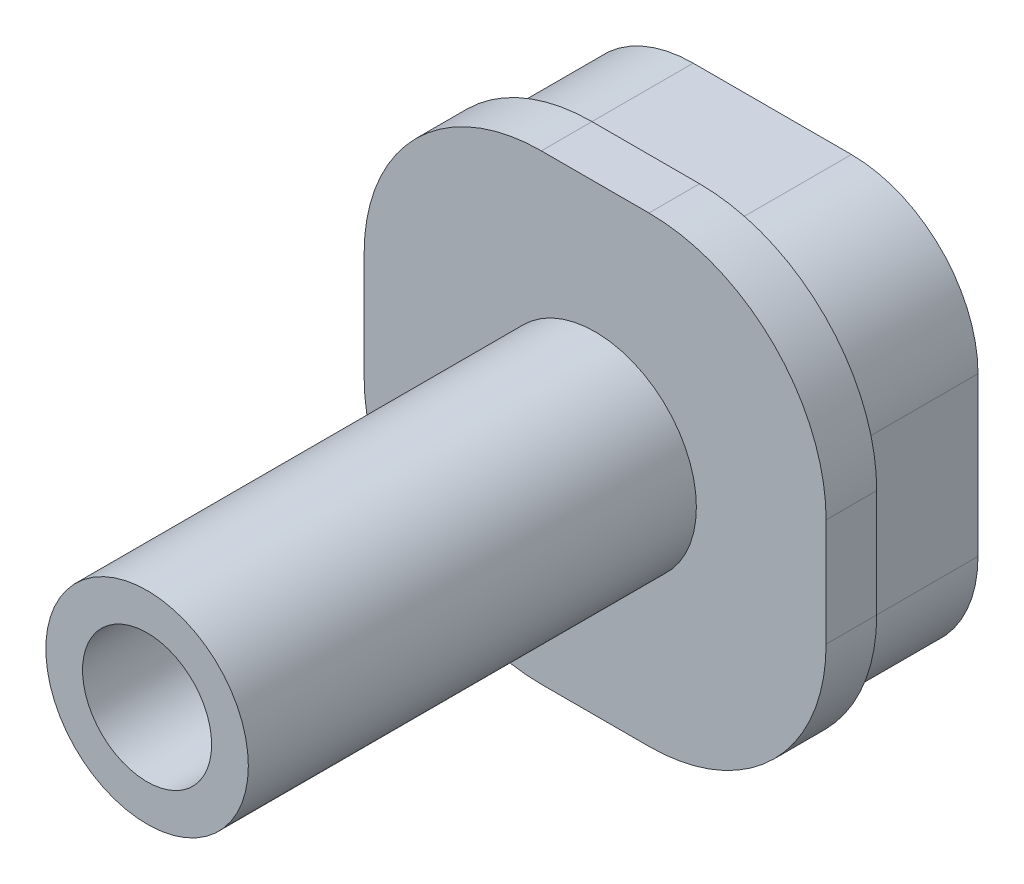
ISO-10303-21;
HEADER;
FILE_DESCRIPTION(('STEP AP214'),'2;1');
FILE_NAME('part.step','',(''),(''),'','','');
FILE_SCHEMA(('AUTOMOTIVE_DESIGN { 1 0 10303 214 1 1 1 1 }'));
ENDSEC;
DATA;
#1=APPLICATION_CONTEXT('core data for automotive mechanical design processes');
#2=APPLICATION_PROTOCOL_DEFINITION('international standard','automotive_design',2000,#1);
#3=PRODUCT_CONTEXT('',#1,'mechanical');
#4=PRODUCT('Part','Part','',(#3));
#5=PRODUCT_RELATED_PRODUCT_CATEGORY('part','',(#4));
#6=PRODUCT_DEFINITION_FORMATION('','',#4);
#7=PRODUCT_DEFINITION_CONTEXT('part definition',#1,'design');
#8=PRODUCT_DEFINITION('design','',#6,#7);
#9=PRODUCT_DEFINITION_SHAPE('','',#8);
#10=(LENGTH_UNIT() NAMED_UNIT(*) SI_UNIT(.MILLI.,.METRE.));
#11=(NAMED_UNIT(*) PLANE_ANGLE_UNIT() SI_UNIT($,.RADIAN.));
#12=(NAMED_UNIT(*) SI_UNIT($,.STERADIAN.) SOLID_ANGLE_UNIT());
#13=UNCERTAINTY_MEASURE_WITH_UNIT(LENGTH_MEASURE(1.E-05),#10,'distance_accuracy_value','');
#14=(GEOMETRIC_REPRESENTATION_CONTEXT(3) GLOBAL_UNCERTAINTY_ASSIGNED_CONTEXT((#13)) GLOBAL_UNIT_ASSIGNED_CONTEXT((#10,
#11,#12)) REPRESENTATION_CONTEXT('',''));
#15=CARTESIAN_POINT('',(0.,0.,0.));
#16=DIRECTION('',(0.,0.,1.));
#17=DIRECTION('',(1.,0.,0.));
#18=AXIS2_PLACEMENT_3D('',#15,#16,#17);
#19=CARTESIAN_POINT('',(0.,0.,0.));
#20=DIRECTION('',(0.,0.,1.));
#21=DIRECTION('',(1.,0.,0.));
#22=AXIS2_PLACEMENT_3D('',#19,#20,#21);
#23=PLANE('',#22);
#24=DIRECTION('',(1.,0.,0.));
#25=VECTOR('',#24,1.);
#26=CARTESIAN_POINT('',(8.125,-8.125,0.));
#27=LINE('',#26,#25);
#28=CARTESIAN_POINT('',(-3.125,-8.125,0.));
#29=VERTEX_POINT('',#28);
#30=CARTESIAN_POINT('',(3.125,-8.125,0.));
#31=VERTEX_POINT('',#30);
#32=EDGE_CURVE('E315',#29,#31,#27,.T.);
#33=ORIENTED_EDGE('',*,*,#32,.F.);
#34=CARTESIAN_POINT('',(-3.125,-3.125,0.));
#35=DIRECTION('',(0.,0.,1.));
#36=DIRECTION('',(1.,0.,0.));
#37=AXIS2_PLACEMENT_3D('',#34,#35,#36);
#38=CIRCLE('',#37,5.);
#39=CARTESIAN_POINT('',(-8.125,-3.125,0.));
#40=VERTEX_POINT('',#39);
#41=EDGE_CURVE('E348',#29,#40,#38,.F.);
#42=ORIENTED_EDGE('',*,*,#41,.T.);
#43=DIRECTION('',(0.,-1.,0.));
#44=VECTOR('',#43,1.);
#45=CARTESIAN_POINT('',(-8.125,-8.125,0.));
#46=LINE('',#45,#44);
#47=CARTESIAN_POINT('',(-8.125,3.125,0.));
#48=VERTEX_POINT('',#47);
#49=EDGE_CURVE('E288',#48,#40,#46,.T.);
#50=ORIENTED_EDGE('',*,*,#49,.F.);
#51=CARTESIAN_POINT('',(-3.125,3.125,0.));
#52=DIRECTION('',(0.,0.,1.));
#53=DIRECTION('',(1.,0.,0.));
#54=AXIS2_PLACEMENT_3D('',#51,#52,#53);
#55=CIRCLE('',#54,5.);
#56=CARTESIAN_POINT('',(-3.125,8.125,0.));
#57=VERTEX_POINT('',#56);
#58=EDGE_CURVE('E344',#48,#57,#55,.F.);
#59=ORIENTED_EDGE('',*,*,#58,.T.);
#60=DIRECTION('',(-1.,0.,0.));
#61=VECTOR('',#60,1.);
#62=CARTESIAN_POINT('',(8.125,8.125,0.));
#63=LINE('',#62,#61);
#64=CARTESIAN_POINT('',(3.125,8.125,0.));
#65=VERTEX_POINT('',#64);
#66=EDGE_CURVE('E303',#65,#57,#63,.T.);
#67=ORIENTED_EDGE('',*,*,#66,.F.);
#68=CARTESIAN_POINT('',(3.125,3.125,0.));
#69=DIRECTION('',(0.,0.,1.));
#70=DIRECTION('',(1.,0.,0.));
#71=AXIS2_PLACEMENT_3D('',#68,#69,#70);
#72=CIRCLE('',#71,5.);
#73=CARTESIAN_POINT('',(8.125,3.125,0.));
#74=VERTEX_POINT('',#73);
#75=EDGE_CURVE('E342',#65,#74,#72,.F.);
#76=ORIENTED_EDGE('',*,*,#75,.T.);
#77=DIRECTION('',(0.,1.,0.));
#78=VECTOR('',#77,1.);
#79=CARTESIAN_POINT('',(8.125,-8.125,0.));
#80=LINE('',#79,#78);
#81=CARTESIAN_POINT('',(8.125,-3.125,0.));
#82=VERTEX_POINT('',#81);
#83=EDGE_CURVE('E318',#82,#74,#80,.T.);
#84=ORIENTED_EDGE('',*,*,#83,.F.);
#85=CARTESIAN_POINT('',(3.125,-3.125,0.));
#86=DIRECTION('',(0.,0.,1.));
#87=DIRECTION('',(1.,0.,0.));
#88=AXIS2_PLACEMENT_3D('',#85,#86,#87);
#89=CIRCLE('',#88,5.);
#90=EDGE_CURVE('E346',#82,#31,#89,.F.);
#91=ORIENTED_EDGE('',*,*,#90,.T.);
#92=EDGE_LOOP('',(#33,#42,#50,#59,#67,#76,#84,#91));
#93=FACE_BOUND('',#92,.T.);
#94=DIRECTION('',(1.,0.,0.));
#95=VECTOR('',#94,1.);
#96=CARTESIAN_POINT('',(6.125,-6.125,0.));
#97=LINE('',#96,#95);
#98=CARTESIAN_POINT('',(-1.125,-6.125,0.));
#99=VERTEX_POINT('',#98);
#100=CARTESIAN_POINT('',(1.125,-6.125,0.));
#101=VERTEX_POINT('',#100);
#102=EDGE_CURVE('E283',#99,#101,#97,.T.);
#103=ORIENTED_EDGE('',*,*,#102,.T.);
#104=CARTESIAN_POINT('',(1.125,-1.125,0.));
#105=DIRECTION('',(0.,0.,1.));
#106=DIRECTION('',(1.,0.,0.));
#107=AXIS2_PLACEMENT_3D('',#104,#105,#106);
#108=CIRCLE('',#107,5.);
#109=CARTESIAN_POINT('',(6.125,-1.125,0.));
#110=VERTEX_POINT('',#109);
#111=EDGE_CURVE('E377',#101,#110,#108,.T.);
#112=ORIENTED_EDGE('',*,*,#111,.T.);
#113=DIRECTION('',(0.,1.,0.));
#114=VECTOR('',#113,1.);
#115=CARTESIAN_POINT('',(6.125,-6.125,0.));
#116=LINE('',#115,#114);
#117=CARTESIAN_POINT('',(6.125,1.125,0.));
#118=VERTEX_POINT('',#117);
#119=EDGE_CURVE('E289',#110,#118,#116,.T.);
#120=ORIENTED_EDGE('',*,*,#119,.T.);
#121=CARTESIAN_POINT('',(1.125,1.125,0.));
#122=DIRECTION('',(0.,0.,1.));
#123=DIRECTION('',(1.,0.,0.));
#124=AXIS2_PLACEMENT_3D('',#121,#122,#123);
#125=CIRCLE('',#124,5.);
#126=CARTESIAN_POINT('',(1.125,6.125,0.));
#127=VERTEX_POINT('',#126);
#128=EDGE_CURVE('E386',#118,#127,#125,.T.);
#129=ORIENTED_EDGE('',*,*,#128,.T.);
#130=DIRECTION('',(-1.,0.,0.));
#131=VECTOR('',#130,1.);
#132=CARTESIAN_POINT('',(6.125,6.125,0.));
#133=LINE('',#132,#131);
#134=CARTESIAN_POINT('',(-1.125,6.125,0.));
#135=VERTEX_POINT('',#134);
#136=EDGE_CURVE('E292',#127,#135,#133,.T.);
#137=ORIENTED_EDGE('',*,*,#136,.T.);
#138=CARTESIAN_POINT('',(-1.125,1.125,0.));
#139=DIRECTION('',(0.,0.,1.));
#140=DIRECTION('',(1.,0.,0.));
#141=AXIS2_PLACEMENT_3D('',#138,#139,#140);
#142=CIRCLE('',#141,5.);
#143=CARTESIAN_POINT('',(-6.125,1.125,0.));
#144=VERTEX_POINT('',#143);
#145=EDGE_CURVE('E206',#135,#144,#142,.T.);
#146=ORIENTED_EDGE('',*,*,#145,.T.);
#147=DIRECTION('',(0.,-1.,0.));
#148=VECTOR('',#147,1.);
#149=CARTESIAN_POINT('',(-6.125,-6.125,0.));
#150=LINE('',#149,#148);
#151=CARTESIAN_POINT('',(-6.125,-1.125,0.));
#152=VERTEX_POINT('',#151);
#153=EDGE_CURVE('E294',#144,#152,#150,.T.);
#154=ORIENTED_EDGE('',*,*,#153,.T.);
#155=CARTESIAN_POINT('',(-1.125,-1.125,0.));
#156=DIRECTION('',(0.,0.,1.));
#157=DIRECTION('',(1.,0.,0.));
#158=AXIS2_PLACEMENT_3D('',#155,#156,#157);
#159=CIRCLE('',#158,5.);
#160=EDGE_CURVE('E382',#152,#99,#159,.T.);
#161=ORIENTED_EDGE('',*,*,#160,.T.);
#162=EDGE_LOOP('',(#103,#112,#120,#129,#137,#146,#154,#161));
#163=FACE_BOUND('',#162,.T.);
#164=ADVANCED_FACE('F36',(#93,#163),#23,.F.);
#165=CARTESIAN_POINT('',(-8.125,-8.125,5.));
#166=DIRECTION('',(1.,0.,0.));
#167=DIRECTION('',(0.,0.,-1.));
#168=AXIS2_PLACEMENT_3D('',#165,#166,#167);
#169=PLANE('',#168);
#170=ORIENTED_EDGE('',*,*,#49,.T.);
#171=DIRECTION('',(0.,0.,-1.));
#172=VECTOR('',#171,1.);
#173=CARTESIAN_POINT('',(-8.125,-3.125,5.));
#174=LINE('',#173,#172);
#175=CARTESIAN_POINT('',(-8.125,-3.125,5.));
#176=VERTEX_POINT('',#175);
#177=EDGE_CURVE('E353',#40,#176,#174,.F.);
#178=ORIENTED_EDGE('',*,*,#177,.T.);
#179=DIRECTION('',(0.,-1.,0.));
#180=VECTOR('',#179,1.);
#181=CARTESIAN_POINT('',(-8.125,-8.125,5.));
#182=LINE('',#181,#180);
#183=CARTESIAN_POINT('',(-8.125,3.125,5.));
#184=VERTEX_POINT('',#183);
#185=EDGE_CURVE('E299',#184,#176,#182,.T.);
#186=ORIENTED_EDGE('',*,*,#185,.F.);
#187=DIRECTION('',(0.,0.,-1.));
#188=VECTOR('',#187,1.);
#189=CARTESIAN_POINT('',(-8.125,3.125,5.));
#190=LINE('',#189,#188);
#191=EDGE_CURVE('E350',#184,#48,#190,.T.);
#192=ORIENTED_EDGE('',*,*,#191,.T.);
#193=EDGE_LOOP('',(#170,#178,#186,#192));
#194=FACE_BOUND('',#193,.T.);
#195=ADVANCED_FACE('F421',(#194),#169,.F.);
#196=CARTESIAN_POINT('',(8.125,-8.125,5.));
#197=DIRECTION('',(0.,1.,0.));
#198=DIRECTION('',(-1.,0.,0.));
#199=AXIS2_PLACEMENT_3D('',#196,#197,#198);
#200=PLANE('',#199);
#201=DIRECTION('',(1.,0.,0.));
#202=VECTOR('',#201,1.);
#203=CARTESIAN_POINT('',(8.125,-8.125,5.));
#204=LINE('',#203,#202);
#205=CARTESIAN_POINT('',(-3.125,-8.125,5.));
#206=VERTEX_POINT('',#205);
#207=CARTESIAN_POINT('',(3.125,-8.125,5.));
#208=VERTEX_POINT('',#207);
#209=EDGE_CURVE('E302',#206,#208,#204,.T.);
#210=ORIENTED_EDGE('',*,*,#209,.F.);
#211=DIRECTION('',(0.,0.,-1.));
#212=VECTOR('',#211,1.);
#213=CARTESIAN_POINT('',(-3.125,-8.125,5.));
#214=LINE('',#213,#212);
#215=EDGE_CURVE('E339',#206,#29,#214,.T.);
#216=ORIENTED_EDGE('',*,*,#215,.T.);
#217=ORIENTED_EDGE('',*,*,#32,.T.);
#218=DIRECTION('',(0.,0.,-1.));
#219=VECTOR('',#218,1.);
#220=CARTESIAN_POINT('',(3.125,-8.125,5.));
#221=LINE('',#220,#219);
#222=EDGE_CURVE('E337',#31,#208,#221,.F.);
#223=ORIENTED_EDGE('',*,*,#222,.T.);
#224=EDGE_LOOP('',(#210,#216,#217,#223));
#225=FACE_BOUND('',#224,.T.);
#226=ADVANCED_FACE('F427',(#225),#200,.F.);
#227=CARTESIAN_POINT('',(8.125,-8.125,5.));
#228=DIRECTION('',(-1.,0.,0.));
#229=DIRECTION('',(0.,0.,1.));
#230=AXIS2_PLACEMENT_3D('',#227,#228,#229);
#231=PLANE('',#230);
#232=DIRECTION('',(0.,1.,0.));
#233=VECTOR('',#232,1.);
#234=CARTESIAN_POINT('',(8.125,-8.125,5.));
#235=LINE('',#234,#233);
#236=CARTESIAN_POINT('',(8.125,-3.125,5.));
#237=VERTEX_POINT('',#236);
#238=CARTESIAN_POINT('',(8.125,3.125,5.));
#239=VERTEX_POINT('',#238);
#240=EDGE_CURVE('E306',#237,#239,#235,.T.);
#241=ORIENTED_EDGE('',*,*,#240,.F.);
#242=DIRECTION('',(0.,0.,-1.));
#243=VECTOR('',#242,1.);
#244=CARTESIAN_POINT('',(8.125,-3.125,5.));
#245=LINE('',#244,#243);
#246=EDGE_CURVE('E369',#237,#82,#245,.T.);
#247=ORIENTED_EDGE('',*,*,#246,.T.);
#248=ORIENTED_EDGE('',*,*,#83,.T.);
#249=DIRECTION('',(0.,0.,-1.));
#250=VECTOR('',#249,1.);
#251=CARTESIAN_POINT('',(8.125,3.125,5.));
#252=LINE('',#251,#250);
#253=EDGE_CURVE('E367',#74,#239,#252,.F.);
#254=ORIENTED_EDGE('',*,*,#253,.T.);
#255=EDGE_LOOP('',(#241,#247,#248,#254));
#256=FACE_BOUND('',#255,.T.);
#257=ADVANCED_FACE('F436',(#256),#231,.F.);
#258=CARTESIAN_POINT('',(8.125,8.125,5.));
#259=DIRECTION('',(0.,-1.,0.));
#260=DIRECTION('',(1.,0.,0.));
#261=AXIS2_PLACEMENT_3D('',#258,#259,#260);
#262=PLANE('',#261);
#263=ORIENTED_EDGE('',*,*,#66,.T.);
#264=DIRECTION('',(0.,0.,-1.));
#265=VECTOR('',#264,1.);
#266=CARTESIAN_POINT('',(-3.125,8.125,5.));
#267=LINE('',#266,#265);
#268=CARTESIAN_POINT('',(-3.125,8.125,5.));
#269=VERTEX_POINT('',#268);
#270=EDGE_CURVE('E375',#57,#269,#267,.F.);
#271=ORIENTED_EDGE('',*,*,#270,.T.);
#272=DIRECTION('',(-1.,0.,0.));
#273=VECTOR('',#272,1.);
#274=CARTESIAN_POINT('',(8.125,8.125,5.));
#275=LINE('',#274,#273);
#276=CARTESIAN_POINT('',(3.125,8.125,5.));
#277=VERTEX_POINT('',#276);
#278=EDGE_CURVE('E309',#277,#269,#275,.T.);
#279=ORIENTED_EDGE('',*,*,#278,.F.);
#280=DIRECTION('',(0.,0.,-1.));
#281=VECTOR('',#280,1.);
#282=CARTESIAN_POINT('',(3.125,8.125,5.));
#283=LINE('',#282,#281);
#284=EDGE_CURVE('E372',#277,#65,#283,.T.);
#285=ORIENTED_EDGE('',*,*,#284,.T.);
#286=EDGE_LOOP('',(#263,#271,#279,#285));
#287=FACE_BOUND('',#286,.T.);
#288=ADVANCED_FACE('F433',(#287),#262,.F.);
#289=CARTESIAN_POINT('',(6.125,-6.125,5.));
#290=DIRECTION('',(-1.,0.,0.));
#291=DIRECTION('',(0.,0.,1.));
#292=AXIS2_PLACEMENT_3D('',#289,#290,#291);
#293=PLANE('',#292);
#294=ORIENTED_EDGE('',*,*,#119,.F.);
#295=DIRECTION('',(0.,0.,-1.));
#296=VECTOR('',#295,1.);
#297=CARTESIAN_POINT('',(6.125,-1.125,5.));
#298=LINE('',#297,#296);
#299=CARTESIAN_POINT('',(6.125,-1.125,5.));
#300=VERTEX_POINT('',#299);
#301=EDGE_CURVE('E330',#110,#300,#298,.F.);
#302=ORIENTED_EDGE('',*,*,#301,.T.);
#303=DIRECTION('',(0.,1.,0.));
#304=VECTOR('',#303,1.);
#305=CARTESIAN_POINT('',(6.125,-6.125,5.));
#306=LINE('',#305,#304);
#307=CARTESIAN_POINT('',(6.125,1.125,5.));
#308=VERTEX_POINT('',#307);
#309=EDGE_CURVE('E221',#300,#308,#306,.T.);
#310=ORIENTED_EDGE('',*,*,#309,.T.);
#311=DIRECTION('',(0.,0.,-1.));
#312=VECTOR('',#311,1.);
#313=CARTESIAN_POINT('',(6.125,1.125,0.));
#314=LINE('',#313,#312);
#315=EDGE_CURVE('E327',#308,#118,#314,.T.);
#316=ORIENTED_EDGE('',*,*,#315,.T.);
#317=EDGE_LOOP('',(#294,#302,#310,#316));
#318=FACE_BOUND('',#317,.T.);
#319=ADVANCED_FACE('F393',(#318),#293,.T.);
#320=CARTESIAN_POINT('',(6.125,6.125,5.));
#321=DIRECTION('',(0.,-1.,0.));
#322=DIRECTION('',(1.,0.,0.));
#323=AXIS2_PLACEMENT_3D('',#320,#321,#322);
#324=PLANE('',#323);
#325=ORIENTED_EDGE('',*,*,#136,.F.);
#326=DIRECTION('',(0.,0.,-1.));
#327=VECTOR('',#326,1.);
#328=CARTESIAN_POINT('',(1.125,6.125,5.));
#329=LINE('',#328,#327);
#330=CARTESIAN_POINT('',(1.125,6.125,5.));
#331=VERTEX_POINT('',#330);
#332=EDGE_CURVE('E210',#127,#331,#329,.F.);
#333=ORIENTED_EDGE('',*,*,#332,.T.);
#334=DIRECTION('',(-1.,0.,0.));
#335=VECTOR('',#334,1.);
#336=CARTESIAN_POINT('',(6.125,6.125,5.));
#337=LINE('',#336,#335);
#338=CARTESIAN_POINT('',(-1.125,6.125,5.));
#339=VERTEX_POINT('',#338);
#340=EDGE_CURVE('E214',#331,#339,#337,.T.);
#341=ORIENTED_EDGE('',*,*,#340,.T.);
#342=DIRECTION('',(0.,0.,-1.));
#343=VECTOR('',#342,1.);
#344=CARTESIAN_POINT('',(-1.125,6.125,0.));
#345=LINE('',#344,#343);
#346=EDGE_CURVE('E199',#339,#135,#345,.T.);
#347=ORIENTED_EDGE('',*,*,#346,.T.);
#348=EDGE_LOOP('',(#325,#333,#341,#347));
#349=FACE_BOUND('',#348,.T.);
#350=ADVANCED_FACE('F215',(#349),#324,.T.);
#351=CARTESIAN_POINT('',(-6.125,-6.125,5.));
#352=DIRECTION('',(1.,0.,0.));
#353=DIRECTION('',(0.,0.,-1.));
#354=AXIS2_PLACEMENT_3D('',#351,#352,#353);
#355=PLANE('',#354);
#356=DIRECTION('',(0.,-1.,0.));
#357=VECTOR('',#356,1.);
#358=CARTESIAN_POINT('',(-6.125,-6.125,5.));
#359=LINE('',#358,#357);
#360=CARTESIAN_POINT('',(-6.125,1.125,5.));
#361=VERTEX_POINT('',#360);
#362=CARTESIAN_POINT('',(-6.125,-1.125,5.));
#363=VERTEX_POINT('',#362);
#364=EDGE_CURVE('E220',#361,#363,#359,.T.);
#365=ORIENTED_EDGE('',*,*,#364,.T.);
#366=DIRECTION('',(0.,0.,-1.));
#367=VECTOR('',#366,1.);
#368=CARTESIAN_POINT('',(-6.125,-1.125,0.));
#369=LINE('',#368,#367);
#370=EDGE_CURVE('E211',#363,#152,#369,.T.);
#371=ORIENTED_EDGE('',*,*,#370,.T.);
#372=ORIENTED_EDGE('',*,*,#153,.F.);
#373=DIRECTION('',(0.,0.,-1.));
#374=VECTOR('',#373,1.);
#375=CARTESIAN_POINT('',(-6.125,1.125,5.));
#376=LINE('',#375,#374);
#377=EDGE_CURVE('E332',#144,#361,#376,.F.);
#378=ORIENTED_EDGE('',*,*,#377,.T.);
#379=EDGE_LOOP('',(#365,#371,#372,#378));
#380=FACE_BOUND('',#379,.T.);
#381=ADVANCED_FACE('F411',(#380),#355,.T.);
#382=CARTESIAN_POINT('',(6.125,-6.125,5.));
#383=DIRECTION('',(0.,1.,0.));
#384=DIRECTION('',(-1.,0.,0.));
#385=AXIS2_PLACEMENT_3D('',#382,#383,#384);
#386=PLANE('',#385);
#387=DIRECTION('',(1.,0.,0.));
#388=VECTOR('',#387,1.);
#389=CARTESIAN_POINT('',(6.125,-6.125,5.));
#390=LINE('',#389,#388);
#391=CARTESIAN_POINT('',(-1.125,-6.125,5.));
#392=VERTEX_POINT('',#391);
#393=CARTESIAN_POINT('',(1.125,-6.125,5.));
#394=VERTEX_POINT('',#393);
#395=EDGE_CURVE('E286',#392,#394,#390,.T.);
#396=ORIENTED_EDGE('',*,*,#395,.T.);
#397=DIRECTION('',(0.,0.,-1.));
#398=VECTOR('',#397,1.);
#399=CARTESIAN_POINT('',(1.125,-6.125,0.));
#400=LINE('',#399,#398);
#401=EDGE_CURVE('E324',#394,#101,#400,.T.);
#402=ORIENTED_EDGE('',*,*,#401,.T.);
#403=ORIENTED_EDGE('',*,*,#102,.F.);
#404=DIRECTION('',(0.,0.,-1.));
#405=VECTOR('',#404,1.);
#406=CARTESIAN_POINT('',(-1.125,-6.125,5.));
#407=LINE('',#406,#405);
#408=EDGE_CURVE('E312',#99,#392,#407,.F.);
#409=ORIENTED_EDGE('',*,*,#408,.T.);
#410=EDGE_LOOP('',(#396,#402,#403,#409));
#411=FACE_BOUND('',#410,.T.);
#412=ADVANCED_FACE('F402',(#411),#386,.T.);
#413=CARTESIAN_POINT('',(1.125,-1.125,5.));
#414=DIRECTION('',(0.,0.,1.));
#415=DIRECTION('',(1.,0.,0.));
#416=AXIS2_PLACEMENT_3D('',#413,#414,#415);
#417=CYLINDRICAL_SURFACE('',#416,5.);
#418=CARTESIAN_POINT('',(1.125,-1.125,5.));
#419=DIRECTION('',(0.,0.,1.));
#420=DIRECTION('',(1.,0.,0.));
#421=AXIS2_PLACEMENT_3D('',#418,#419,#420);
#422=CIRCLE('',#421,5.);
#423=EDGE_CURVE('E379',#300,#394,#422,.F.);
#424=ORIENTED_EDGE('',*,*,#423,.F.);
#425=ORIENTED_EDGE('',*,*,#301,.F.);
#426=ORIENTED_EDGE('',*,*,#111,.F.);
#427=ORIENTED_EDGE('',*,*,#401,.F.);
#428=EDGE_LOOP('',(#424,#425,#426,#427));
#429=FACE_BOUND('',#428,.T.);
#430=ADVANCED_FACE('F400',(#429),#417,.F.);
#431=CARTESIAN_POINT('',(-1.125,-1.125,5.));
#432=DIRECTION('',(0.,0.,1.));
#433=DIRECTION('',(1.,0.,0.));
#434=AXIS2_PLACEMENT_3D('',#431,#432,#433);
#435=CYLINDRICAL_SURFACE('',#434,5.);
#436=CARTESIAN_POINT('',(-1.125,-1.125,5.));
#437=DIRECTION('',(0.,0.,1.));
#438=DIRECTION('',(1.,0.,0.));
#439=AXIS2_PLACEMENT_3D('',#436,#437,#438);
#440=CIRCLE('',#439,5.);
#441=EDGE_CURVE('E384',#392,#363,#440,.F.);
#442=ORIENTED_EDGE('',*,*,#441,.F.);
#443=ORIENTED_EDGE('',*,*,#408,.F.);
#444=ORIENTED_EDGE('',*,*,#160,.F.);
#445=ORIENTED_EDGE('',*,*,#370,.F.);
#446=EDGE_LOOP('',(#442,#443,#444,#445));
#447=FACE_BOUND('',#446,.T.);
#448=ADVANCED_FACE('F408',(#447),#435,.F.);
#449=CARTESIAN_POINT('',(1.125,1.125,5.));
#450=DIRECTION('',(0.,0.,1.));
#451=DIRECTION('',(1.,0.,0.));
#452=AXIS2_PLACEMENT_3D('',#449,#450,#451);
#453=CYLINDRICAL_SURFACE('',#452,5.);
#454=CARTESIAN_POINT('',(1.125,1.125,5.));
#455=DIRECTION('',(0.,0.,1.));
#456=DIRECTION('',(1.,0.,0.));
#457=AXIS2_PLACEMENT_3D('',#454,#455,#456);
#458=CIRCLE('',#457,5.);
#459=EDGE_CURVE('E229',#331,#308,#458,.F.);
#460=ORIENTED_EDGE('',*,*,#459,.F.);
#461=ORIENTED_EDGE('',*,*,#332,.F.);
#462=ORIENTED_EDGE('',*,*,#128,.F.);
#463=ORIENTED_EDGE('',*,*,#315,.F.);
#464=EDGE_LOOP('',(#460,#461,#462,#463));
#465=FACE_BOUND('',#464,.T.);
#466=ADVANCED_FACE('F390',(#465),#453,.F.);
#467=CARTESIAN_POINT('',(-1.125,1.125,5.));
#468=DIRECTION('',(0.,0.,1.));
#469=DIRECTION('',(1.,0.,0.));
#470=AXIS2_PLACEMENT_3D('',#467,#468,#469);
#471=CYLINDRICAL_SURFACE('',#470,5.);
#472=CARTESIAN_POINT('',(-1.125,1.125,5.));
#473=DIRECTION('',(0.,0.,1.));
#474=DIRECTION('',(1.,0.,0.));
#475=AXIS2_PLACEMENT_3D('',#472,#473,#474);
#476=CIRCLE('',#475,5.);
#477=EDGE_CURVE('E204',#361,#339,#476,.F.);
#478=ORIENTED_EDGE('',*,*,#477,.F.);
#479=ORIENTED_EDGE('',*,*,#377,.F.);
#480=ORIENTED_EDGE('',*,*,#145,.F.);
#481=ORIENTED_EDGE('',*,*,#346,.F.);
#482=EDGE_LOOP('',(#478,#479,#480,#481));
#483=FACE_BOUND('',#482,.T.);
#484=ADVANCED_FACE('F201',(#483),#471,.F.);
#485=CARTESIAN_POINT('',(-3.125,-3.125,5.));
#486=DIRECTION('',(0.,0.,-1.));
#487=DIRECTION('',(-1.,0.,0.));
#488=AXIS2_PLACEMENT_3D('',#485,#486,#487);
#489=CYLINDRICAL_SURFACE('',#488,5.);
#490=CARTESIAN_POINT('',(-3.125,-3.125,5.));
#491=DIRECTION('',(0.,0.,1.));
#492=DIRECTION('',(1.,0.,0.));
#493=AXIS2_PLACEMENT_3D('',#490,#491,#492);
#494=CIRCLE('',#493,5.);
#495=EDGE_CURVE('E364',#176,#206,#494,.T.);
#496=ORIENTED_EDGE('',*,*,#495,.F.);
#497=ORIENTED_EDGE('',*,*,#177,.F.);
#498=ORIENTED_EDGE('',*,*,#41,.F.);
#499=ORIENTED_EDGE('',*,*,#215,.F.);
#500=EDGE_LOOP('',(#496,#497,#498,#499));
#501=FACE_BOUND('',#500,.T.);
#502=ADVANCED_FACE('F452',(#501),#489,.T.);
#503=CARTESIAN_POINT('',(3.125,-3.125,5.));
#504=DIRECTION('',(0.,0.,-1.));
#505=DIRECTION('',(-1.,0.,0.));
#506=AXIS2_PLACEMENT_3D('',#503,#504,#505);
#507=CYLINDRICAL_SURFACE('',#506,5.);
#508=CARTESIAN_POINT('',(3.125,-3.125,5.));
#509=DIRECTION('',(0.,0.,1.));
#510=DIRECTION('',(1.,0.,0.));
#511=AXIS2_PLACEMENT_3D('',#508,#509,#510);
#512=CIRCLE('',#511,5.);
#513=EDGE_CURVE('E361',#208,#237,#512,.T.);
#514=ORIENTED_EDGE('',*,*,#513,.F.);
#515=ORIENTED_EDGE('',*,*,#222,.F.);
#516=ORIENTED_EDGE('',*,*,#90,.F.);
#517=ORIENTED_EDGE('',*,*,#246,.F.);
#518=EDGE_LOOP('',(#514,#515,#516,#517));
#519=FACE_BOUND('',#518,.T.);
#520=ADVANCED_FACE('F455',(#519),#507,.T.);
#521=CARTESIAN_POINT('',(-3.125,3.125,5.));
#522=DIRECTION('',(0.,0.,-1.));
#523=DIRECTION('',(-1.,0.,0.));
#524=AXIS2_PLACEMENT_3D('',#521,#522,#523);
#525=CYLINDRICAL_SURFACE('',#524,5.);
#526=CARTESIAN_POINT('',(-3.125,3.125,5.));
#527=DIRECTION('',(0.,0.,1.));
#528=DIRECTION('',(1.,0.,0.));
#529=AXIS2_PLACEMENT_3D('',#526,#527,#528);
#530=CIRCLE('',#529,5.);
#531=EDGE_CURVE('E358',#269,#184,#530,.T.);
#532=ORIENTED_EDGE('',*,*,#531,.F.);
#533=ORIENTED_EDGE('',*,*,#270,.F.);
#534=ORIENTED_EDGE('',*,*,#58,.F.);
#535=ORIENTED_EDGE('',*,*,#191,.F.);
#536=EDGE_LOOP('',(#532,#533,#534,#535));
#537=FACE_BOUND('',#536,.T.);
#538=ADVANCED_FACE('F459',(#537),#525,.T.);
#539=CARTESIAN_POINT('',(3.125,3.125,5.));
#540=DIRECTION('',(0.,0.,-1.));
#541=DIRECTION('',(-1.,0.,0.));
#542=AXIS2_PLACEMENT_3D('',#539,#540,#541);
#543=CYLINDRICAL_SURFACE('',#542,5.);
#544=CARTESIAN_POINT('',(3.125,3.125,5.));
#545=DIRECTION('',(0.,0.,1.));
#546=DIRECTION('',(1.,0.,0.));
#547=AXIS2_PLACEMENT_3D('',#544,#545,#546);
#548=CIRCLE('',#547,5.);
#549=EDGE_CURVE('E355',#239,#277,#548,.T.);
#550=ORIENTED_EDGE('',*,*,#549,.F.);
#551=ORIENTED_EDGE('',*,*,#253,.F.);
#552=ORIENTED_EDGE('',*,*,#75,.F.);
#553=ORIENTED_EDGE('',*,*,#284,.F.);
#554=EDGE_LOOP('',(#550,#551,#552,#553));
#555=FACE_BOUND('',#554,.T.);
#556=ADVANCED_FACE('F463',(#555),#543,.T.);
#557=CARTESIAN_POINT('',(0.,0.,5.));
#558=DIRECTION('',(0.,0.,-1.));
#559=DIRECTION('',(-1.,0.,0.));
#560=AXIS2_PLACEMENT_3D('',#557,#558,#559);
#561=PLANE('',#560);
#562=ORIENTED_EDGE('',*,*,#340,.F.);
#563=ORIENTED_EDGE('',*,*,#459,.T.);
#564=ORIENTED_EDGE('',*,*,#309,.F.);
#565=ORIENTED_EDGE('',*,*,#423,.T.);
#566=ORIENTED_EDGE('',*,*,#395,.F.);
#567=ORIENTED_EDGE('',*,*,#441,.T.);
#568=ORIENTED_EDGE('',*,*,#364,.F.);
#569=ORIENTED_EDGE('',*,*,#477,.T.);
#570=EDGE_LOOP('',(#562,#563,#564,#565,#566,#567,#568,#569));
#571=FACE_BOUND('',#570,.T.);
#572=ADVANCED_FACE('F223',(#571),#561,.T.);
#573=DIRECTION('',(0.,1.,0.));
#574=VECTOR('',#573,1.);
#575=CARTESIAN_POINT('',(9.125,9.125,5.));
#576=LINE('',#575,#574);
#577=CARTESIAN_POINT('',(9.125,-2.125,5.));
#578=VERTEX_POINT('',#577);
#579=CARTESIAN_POINT('',(9.125,2.125,5.));
#580=VERTEX_POINT('',#579);
#581=EDGE_CURVE('E274',#578,#580,#576,.T.);
#582=ORIENTED_EDGE('',*,*,#581,.F.);
#583=CARTESIAN_POINT('',(2.125,-2.125,5.));
#584=DIRECTION('',(0.,0.,-1.));
#585=DIRECTION('',(-1.,0.,0.));
#586=AXIS2_PLACEMENT_3D('',#583,#584,#585);
#587=CIRCLE('',#586,7.);
#588=CARTESIAN_POINT('',(2.125,-9.125,5.));
#589=VERTEX_POINT('',#588);
#590=EDGE_CURVE('E241',#578,#589,#587,.T.);
#591=ORIENTED_EDGE('',*,*,#590,.T.);
#592=DIRECTION('',(1.,0.,0.));
#593=VECTOR('',#592,1.);
#594=CARTESIAN_POINT('',(9.125,-9.125,5.));
#595=LINE('',#594,#593);
#596=CARTESIAN_POINT('',(-2.125,-9.125,5.));
#597=VERTEX_POINT('',#596);
#598=EDGE_CURVE('E279',#597,#589,#595,.T.);
#599=ORIENTED_EDGE('',*,*,#598,.F.);
#600=CARTESIAN_POINT('',(-2.125,-2.125,5.));
#601=DIRECTION('',(0.,0.,-1.));
#602=DIRECTION('',(-1.,0.,0.));
#603=AXIS2_PLACEMENT_3D('',#600,#601,#602);
#604=CIRCLE('',#603,7.);
#605=CARTESIAN_POINT('',(-9.125,-2.125,5.));
#606=VERTEX_POINT('',#605);
#607=EDGE_CURVE('E239',#597,#606,#604,.T.);
#608=ORIENTED_EDGE('',*,*,#607,.T.);
#609=DIRECTION('',(0.,-1.,0.));
#610=VECTOR('',#609,1.);
#611=CARTESIAN_POINT('',(-9.125,9.125,5.));
#612=LINE('',#611,#610);
#613=CARTESIAN_POINT('',(-9.125,2.125,5.));
#614=VERTEX_POINT('',#613);
#615=EDGE_CURVE('E492',#614,#606,#612,.T.);
#616=ORIENTED_EDGE('',*,*,#615,.F.);
#617=CARTESIAN_POINT('',(-2.125,2.125,5.));
#618=DIRECTION('',(0.,0.,-1.));
#619=DIRECTION('',(-1.,0.,0.));
#620=AXIS2_PLACEMENT_3D('',#617,#618,#619);
#621=CIRCLE('',#620,7.);
#622=CARTESIAN_POINT('',(-2.125,9.125,5.));
#623=VERTEX_POINT('',#622);
#624=EDGE_CURVE('E237',#614,#623,#621,.T.);
#625=ORIENTED_EDGE('',*,*,#624,.T.);
#626=DIRECTION('',(-1.,0.,0.));
#627=VECTOR('',#626,1.);
#628=CARTESIAN_POINT('',(9.125,9.125,5.));
#629=LINE('',#628,#627);
#630=CARTESIAN_POINT('',(2.125,9.125,5.));
#631=VERTEX_POINT('',#630);
#632=EDGE_CURVE('E264',#631,#623,#629,.T.);
#633=ORIENTED_EDGE('',*,*,#632,.F.);
#634=CARTESIAN_POINT('',(2.125,2.125,5.));
#635=DIRECTION('',(0.,0.,-1.));
#636=DIRECTION('',(-1.,0.,0.));
#637=AXIS2_PLACEMENT_3D('',#634,#635,#636);
#638=CIRCLE('',#637,7.);
#639=EDGE_CURVE('E235',#631,#580,#638,.T.);
#640=ORIENTED_EDGE('',*,*,#639,.T.);
#641=EDGE_LOOP('',(#582,#591,#599,#608,#616,#625,#633,#640));
#642=FACE_BOUND('',#641,.T.);
#643=ORIENTED_EDGE('',*,*,#531,.T.);
#644=ORIENTED_EDGE('',*,*,#185,.T.);
#645=ORIENTED_EDGE('',*,*,#495,.T.);
#646=ORIENTED_EDGE('',*,*,#209,.T.);
#647=ORIENTED_EDGE('',*,*,#513,.T.);
#648=ORIENTED_EDGE('',*,*,#240,.T.);
#649=ORIENTED_EDGE('',*,*,#549,.T.);
#650=ORIENTED_EDGE('',*,*,#278,.T.);
#651=EDGE_LOOP('',(#643,#644,#645,#646,#647,#648,#649,#650));
#652=FACE_BOUND('',#651,.T.);
#653=ADVANCED_FACE('F269',(#642,#652),#561,.T.);
#654=CARTESIAN_POINT('',(-9.125,9.125,7.));
#655=DIRECTION('',(1.,0.,0.));
#656=DIRECTION('',(0.,0.,-1.));
#657=AXIS2_PLACEMENT_3D('',#654,#655,#656);
#658=PLANE('',#657);
#659=ORIENTED_EDGE('',*,*,#615,.T.);
#660=DIRECTION('',(0.,0.,-1.));
#661=VECTOR('',#660,1.);
#662=CARTESIAN_POINT('',(-9.125,-2.125,7.));
#663=LINE('',#662,#661);
#664=CARTESIAN_POINT('',(-9.125,-2.125,7.));
#665=VERTEX_POINT('',#664);
#666=EDGE_CURVE('E258',#606,#665,#663,.F.);
#667=ORIENTED_EDGE('',*,*,#666,.T.);
#668=DIRECTION('',(0.,-1.,0.));
#669=VECTOR('',#668,1.);
#670=CARTESIAN_POINT('',(-9.125,9.125,7.));
#671=LINE('',#670,#669);
#672=CARTESIAN_POINT('',(-9.125,2.125,7.));
#673=VERTEX_POINT('',#672);
#674=EDGE_CURVE('E273',#673,#665,#671,.T.);
#675=ORIENTED_EDGE('',*,*,#674,.F.);
#676=DIRECTION('',(0.,0.,-1.));
#677=VECTOR('',#676,1.);
#678=CARTESIAN_POINT('',(-9.125,2.125,7.));
#679=LINE('',#678,#677);
#680=EDGE_CURVE('E255',#673,#614,#679,.T.);
#681=ORIENTED_EDGE('',*,*,#680,.T.);
#682=EDGE_LOOP('',(#659,#667,#675,#681));
#683=FACE_BOUND('',#682,.T.);
#684=ADVANCED_FACE('F490',(#683),#658,.F.);
#685=CARTESIAN_POINT('',(9.125,-9.125,7.));
#686=DIRECTION('',(0.,1.,0.));
#687=DIRECTION('',(0.,0.,1.));
#688=AXIS2_PLACEMENT_3D('',#685,#686,#687);
#689=PLANE('',#688);
#690=ORIENTED_EDGE('',*,*,#598,.T.);
#691=DIRECTION('',(0.,0.,-1.));
#692=VECTOR('',#691,1.);
#693=CARTESIAN_POINT('',(2.125,-9.125,7.));
#694=LINE('',#693,#692);
#695=CARTESIAN_POINT('',(2.125,-9.125,7.));
#696=VERTEX_POINT('',#695);
#697=EDGE_CURVE('E246',#589,#696,#694,.F.);
#698=ORIENTED_EDGE('',*,*,#697,.T.);
#699=DIRECTION('',(1.,0.,0.));
#700=VECTOR('',#699,1.);
#701=CARTESIAN_POINT('',(9.125,-9.125,7.));
#702=LINE('',#701,#700);
#703=CARTESIAN_POINT('',(-2.125,-9.125,7.));
#704=VERTEX_POINT('',#703);
#705=EDGE_CURVE('E277',#704,#696,#702,.T.);
#706=ORIENTED_EDGE('',*,*,#705,.F.);
#707=DIRECTION('',(0.,0.,-1.));
#708=VECTOR('',#707,1.);
#709=CARTESIAN_POINT('',(-2.125,-9.125,7.));
#710=LINE('',#709,#708);
#711=EDGE_CURVE('E243',#704,#597,#710,.T.);
#712=ORIENTED_EDGE('',*,*,#711,.T.);
#713=EDGE_LOOP('',(#690,#698,#706,#712));
#714=FACE_BOUND('',#713,.T.);
#715=ADVANCED_FACE('F498',(#714),#689,.F.);
#716=CARTESIAN_POINT('',(9.125,9.125,7.));
#717=DIRECTION('',(-1.,0.,0.));
#718=DIRECTION('',(0.,0.,1.));
#719=AXIS2_PLACEMENT_3D('',#716,#717,#718);
#720=PLANE('',#719);
#721=DIRECTION('',(0.,1.,0.));
#722=VECTOR('',#721,1.);
#723=CARTESIAN_POINT('',(9.125,9.125,7.));
#724=LINE('',#723,#722);
#725=CARTESIAN_POINT('',(9.125,-2.125,7.));
#726=VERTEX_POINT('',#725);
#727=CARTESIAN_POINT('',(9.125,2.125,7.));
#728=VERTEX_POINT('',#727);
#729=EDGE_CURVE('E501',#726,#728,#724,.T.);
#730=ORIENTED_EDGE('',*,*,#729,.F.);
#731=DIRECTION('',(0.,0.,-1.));
#732=VECTOR('',#731,1.);
#733=CARTESIAN_POINT('',(9.125,-2.125,7.));
#734=LINE('',#733,#732);
#735=EDGE_CURVE('E227',#726,#578,#734,.T.);
#736=ORIENTED_EDGE('',*,*,#735,.T.);
#737=ORIENTED_EDGE('',*,*,#581,.T.);
#738=DIRECTION('',(0.,0.,-1.));
#739=VECTOR('',#738,1.);
#740=CARTESIAN_POINT('',(9.125,2.125,7.));
#741=LINE('',#740,#739);
#742=EDGE_CURVE('E225',#580,#728,#741,.F.);
#743=ORIENTED_EDGE('',*,*,#742,.T.);
#744=EDGE_LOOP('',(#730,#736,#737,#743));
#745=FACE_BOUND('',#744,.T.);
#746=ADVANCED_FACE('F510',(#745),#720,.F.);
#747=CARTESIAN_POINT('',(9.125,9.125,7.));
#748=DIRECTION('',(0.,-1.,0.));
#749=DIRECTION('',(0.,0.,-1.));
#750=AXIS2_PLACEMENT_3D('',#747,#748,#749);
#751=PLANE('',#750);
#752=ORIENTED_EDGE('',*,*,#632,.T.);
#753=DIRECTION('',(0.,0.,-1.));
#754=VECTOR('',#753,1.);
#755=CARTESIAN_POINT('',(-2.125,9.125,7.));
#756=LINE('',#755,#754);
#757=CARTESIAN_POINT('',(-2.125,9.125,7.));
#758=VERTEX_POINT('',#757);
#759=EDGE_CURVE('E40',#623,#758,#756,.F.);
#760=ORIENTED_EDGE('',*,*,#759,.T.);
#761=DIRECTION('',(-1.,0.,0.));
#762=VECTOR('',#761,1.);
#763=CARTESIAN_POINT('',(9.125,9.125,7.));
#764=LINE('',#763,#762);
#765=CARTESIAN_POINT('',(2.125,9.125,7.));
#766=VERTEX_POINT('',#765);
#767=EDGE_CURVE('E265',#766,#758,#764,.T.);
#768=ORIENTED_EDGE('',*,*,#767,.F.);
#769=DIRECTION('',(0.,0.,-1.));
#770=VECTOR('',#769,1.);
#771=CARTESIAN_POINT('',(2.125,9.125,7.));
#772=LINE('',#771,#770);
#773=EDGE_CURVE('E259',#766,#631,#772,.T.);
#774=ORIENTED_EDGE('',*,*,#773,.T.);
#775=EDGE_LOOP('',(#752,#760,#768,#774));
#776=FACE_BOUND('',#775,.T.);
#777=ADVANCED_FACE('F263',(#776),#751,.F.);
#778=CARTESIAN_POINT('',(0.,0.,7.));
#779=DIRECTION('',(0.,0.,-1.));
#780=DIRECTION('',(-1.,0.,0.));
#781=AXIS2_PLACEMENT_3D('',#778,#779,#780);
#782=PLANE('',#781);
#783=CARTESIAN_POINT('',(0.,0.,7.));
#784=DIRECTION('',(0.,0.,1.));
#785=DIRECTION('',(1.,0.,0.));
#786=AXIS2_PLACEMENT_3D('',#783,#784,#785);
#787=CIRCLE('',#786,4.);
#788=CARTESIAN_POINT('',(4.,0.,7.));
#789=VERTEX_POINT('',#788);
#790=EDGE_CURVE('E13',#789,#789,#787,.T.);
#791=ORIENTED_EDGE('',*,*,#790,.F.);
#792=EDGE_LOOP('',(#791));
#793=FACE_BOUND('',#792,.T.);
#794=ORIENTED_EDGE('',*,*,#705,.T.);
#795=CARTESIAN_POINT('',(2.125,-2.125,7.));
#796=DIRECTION('',(0.,0.,-1.));
#797=DIRECTION('',(-1.,0.,0.));
#798=AXIS2_PLACEMENT_3D('',#795,#796,#797);
#799=CIRCLE('',#798,7.);
#800=EDGE_CURVE('E253',#696,#726,#799,.F.);
#801=ORIENTED_EDGE('',*,*,#800,.T.);
#802=ORIENTED_EDGE('',*,*,#729,.T.);
#803=CARTESIAN_POINT('',(2.125,2.125,7.));
#804=DIRECTION('',(0.,0.,-1.));
#805=DIRECTION('',(-1.,0.,0.));
#806=AXIS2_PLACEMENT_3D('',#803,#804,#805);
#807=CIRCLE('',#806,7.);
#808=EDGE_CURVE('E58',#728,#766,#807,.F.);
#809=ORIENTED_EDGE('',*,*,#808,.T.);
#810=ORIENTED_EDGE('',*,*,#767,.T.);
#811=CARTESIAN_POINT('',(-2.125,2.125,7.));
#812=DIRECTION('',(0.,0.,-1.));
#813=DIRECTION('',(-1.,0.,0.));
#814=AXIS2_PLACEMENT_3D('',#811,#812,#813);
#815=CIRCLE('',#814,7.);
#816=EDGE_CURVE('E249',#758,#673,#815,.F.);
#817=ORIENTED_EDGE('',*,*,#816,.T.);
#818=ORIENTED_EDGE('',*,*,#674,.T.);
#819=CARTESIAN_POINT('',(-2.125,-2.125,7.));
#820=DIRECTION('',(0.,0.,-1.));
#821=DIRECTION('',(-1.,0.,0.));
#822=AXIS2_PLACEMENT_3D('',#819,#820,#821);
#823=CIRCLE('',#822,7.);
#824=EDGE_CURVE('E251',#665,#704,#823,.F.);
#825=ORIENTED_EDGE('',*,*,#824,.T.);
#826=EDGE_LOOP('',(#794,#801,#802,#809,#810,#817,#818,#825));
#827=FACE_BOUND('',#826,.T.);
#828=ADVANCED_FACE('F472',(#793,#827),#782,.F.);
#829=CARTESIAN_POINT('',(2.125,-2.125,7.));
#830=DIRECTION('',(0.,0.,-1.));
#831=DIRECTION('',(-1.,0.,0.));
#832=AXIS2_PLACEMENT_3D('',#829,#830,#831);
#833=CYLINDRICAL_SURFACE('',#832,7.);
#834=ORIENTED_EDGE('',*,*,#800,.F.);
#835=ORIENTED_EDGE('',*,*,#697,.F.);
#836=ORIENTED_EDGE('',*,*,#590,.F.);
#837=ORIENTED_EDGE('',*,*,#735,.F.);
#838=EDGE_LOOP('',(#834,#835,#836,#837));
#839=FACE_BOUND('',#838,.T.);
#840=ADVANCED_FACE('F468',(#839),#833,.T.);
#841=CARTESIAN_POINT('',(-2.125,-2.125,7.));
#842=DIRECTION('',(0.,0.,-1.));
#843=DIRECTION('',(-1.,0.,0.));
#844=AXIS2_PLACEMENT_3D('',#841,#842,#843);
#845=CYLINDRICAL_SURFACE('',#844,7.);
#846=ORIENTED_EDGE('',*,*,#824,.F.);
#847=ORIENTED_EDGE('',*,*,#666,.F.);
#848=ORIENTED_EDGE('',*,*,#607,.F.);
#849=ORIENTED_EDGE('',*,*,#711,.F.);
#850=EDGE_LOOP('',(#846,#847,#848,#849));
#851=FACE_BOUND('',#850,.T.);
#852=ADVANCED_FACE('F471',(#851),#845,.T.);
#853=CARTESIAN_POINT('',(-2.125,2.125,7.));
#854=DIRECTION('',(0.,0.,-1.));
#855=DIRECTION('',(-1.,0.,0.));
#856=AXIS2_PLACEMENT_3D('',#853,#854,#855);
#857=CYLINDRICAL_SURFACE('',#856,7.);
#858=ORIENTED_EDGE('',*,*,#816,.F.);
#859=ORIENTED_EDGE('',*,*,#759,.F.);
#860=ORIENTED_EDGE('',*,*,#624,.F.);
#861=ORIENTED_EDGE('',*,*,#680,.F.);
#862=EDGE_LOOP('',(#858,#859,#860,#861));
#863=FACE_BOUND('',#862,.T.);
#864=ADVANCED_FACE('F475',(#863),#857,.T.);
#865=CARTESIAN_POINT('',(2.125,2.125,7.));
#866=DIRECTION('',(0.,0.,-1.));
#867=DIRECTION('',(-1.,0.,0.));
#868=AXIS2_PLACEMENT_3D('',#865,#866,#867);
#869=CYLINDRICAL_SURFACE('',#868,7.);
#870=ORIENTED_EDGE('',*,*,#808,.F.);
#871=ORIENTED_EDGE('',*,*,#742,.F.);
#872=ORIENTED_EDGE('',*,*,#639,.F.);
#873=ORIENTED_EDGE('',*,*,#773,.F.);
#874=EDGE_LOOP('',(#870,#871,#872,#873));
#875=FACE_BOUND('',#874,.T.);
#876=ADVANCED_FACE('F38',(#875),#869,.T.);
#877=CARTESIAN_POINT('',(0.,0.,24.7));
#878=DIRECTION('',(0.,0.,-1.));
#879=DIRECTION('',(-1.,0.,0.));
#880=AXIS2_PLACEMENT_3D('',#877,#878,#879);
#881=CYLINDRICAL_SURFACE('',#880,4.);
#882=CARTESIAN_POINT('',(0.,0.,24.7));
#883=DIRECTION('',(0.,0.,1.));
#884=DIRECTION('',(1.,0.,0.));
#885=AXIS2_PLACEMENT_3D('',#882,#883,#884);
#886=CIRCLE('',#885,4.);
#887=CARTESIAN_POINT('',(4.,0.,24.7));
#888=VERTEX_POINT('',#887);
#889=EDGE_CURVE('E506',#888,#888,#886,.T.);
#890=ORIENTED_EDGE('',*,*,#889,.F.);
#891=EDGE_LOOP('',(#890));
#892=FACE_BOUND('',#891,.T.);
#893=ORIENTED_EDGE('',*,*,#790,.T.);
#894=EDGE_LOOP('',(#893));
#895=FACE_BOUND('',#894,.T.);
#896=ADVANCED_FACE('F482',(#892,#895),#881,.T.);
#897=CARTESIAN_POINT('',(0.,0.,24.7));
#898=DIRECTION('',(0.,0.,1.));
#899=DIRECTION('',(1.,0.,0.));
#900=AXIS2_PLACEMENT_3D('',#897,#898,#899);
#901=PLANE('',#900);
#902=CARTESIAN_POINT('',(0.,0.,24.7));
#903=DIRECTION('',(0.,0.,1.));
#904=DIRECTION('',(1.,0.,0.));
#905=AXIS2_PLACEMENT_3D('',#902,#903,#904);
#906=CIRCLE('',#905,2.55);
#907=CARTESIAN_POINT('',(2.55,0.,24.7));
#908=VERTEX_POINT('',#907);
#909=EDGE_CURVE('E552',#908,#908,#906,.T.);
#910=ORIENTED_EDGE('',*,*,#909,.F.);
#911=EDGE_LOOP('',(#910));
#912=FACE_BOUND('',#911,.T.);
#913=ORIENTED_EDGE('',*,*,#889,.T.);
#914=EDGE_LOOP('',(#913));
#915=FACE_BOUND('',#914,.T.);
#916=ADVANCED_FACE('F535',(#912,#915),#901,.T.);
#917=CARTESIAN_POINT('',(0.,0.,8.));
#918=DIRECTION('',(0.,0.,-1.));
#919=DIRECTION('',(-1.,0.,0.));
#920=AXIS2_PLACEMENT_3D('',#917,#918,#919);
#921=PLANE('',#920);
#922=CARTESIAN_POINT('',(0.,0.,8.));
#923=DIRECTION('',(0.,0.,-1.));
#924=DIRECTION('',(-1.,0.,0.));
#925=AXIS2_PLACEMENT_3D('',#922,#923,#924);
#926=CIRCLE('',#925,2.55);
#927=CARTESIAN_POINT('',(-2.55,0.,8.));
#928=VERTEX_POINT('',#927);
#929=EDGE_CURVE('E555',#928,#928,#926,.F.);
#930=ORIENTED_EDGE('',*,*,#929,.T.);
#931=EDGE_LOOP('',(#930));
#932=FACE_BOUND('',#931,.T.);
#933=ADVANCED_FACE('F539',(#932),#921,.F.);
#934=CARTESIAN_POINT('',(0.,0.,-0.212489168102785));
#935=DIRECTION('',(0.,0.,1.));
#936=DIRECTION('',(1.,0.,0.));
#937=AXIS2_PLACEMENT_3D('',#934,#935,#936);
#938=CYLINDRICAL_SURFACE('',#937,2.55);
#939=ORIENTED_EDGE('',*,*,#909,.T.);
#940=EDGE_LOOP('',(#939));
#941=FACE_BOUND('',#940,.T.);
#942=ORIENTED_EDGE('',*,*,#929,.F.);
#943=EDGE_LOOP('',(#942));
#944=FACE_BOUND('',#943,.T.);
#945=ADVANCED_FACE('F543',(#941,#944),#938,.F.);
#946=CLOSED_SHELL('',(#164,#195,#226,#257,#288,#319,#350,#381,#412,#430,#448,#466,#484,#502,
#520,#538,#556,#572,#653,#684,#715,#746,#777,#828,#840,#852,#864,#876,#896,#916,#933,#945));
#947=MANIFOLD_SOLID_BREP('B2',#946);
#948=ADVANCED_BREP_SHAPE_REPRESENTATION('',(#18,#947),#14);
#949=SHAPE_DEFINITION_REPRESENTATION(#9,#948);
ENDSEC;
END-ISO-10303-21;
